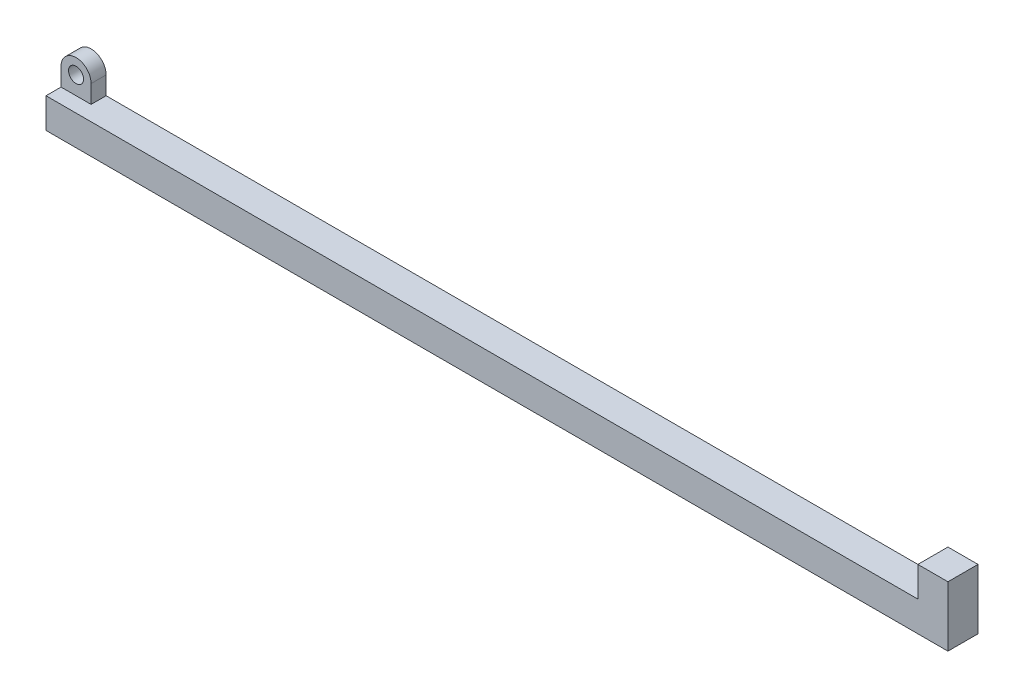
ISO-10303-21;
HEADER;
FILE_DESCRIPTION(('STEP AP214'),'2;1');
FILE_NAME('part.step','',(''),(''),'','','');
FILE_SCHEMA(('AUTOMOTIVE_DESIGN { 1 0 10303 214 1 1 1 1 }'));
ENDSEC;
DATA;
#1=APPLICATION_CONTEXT('core data for automotive mechanical design processes');
#2=APPLICATION_PROTOCOL_DEFINITION('international standard','automotive_design',2000,#1);
#3=PRODUCT_CONTEXT('',#1,'mechanical');
#4=PRODUCT('Part','Part','',(#3));
#5=PRODUCT_RELATED_PRODUCT_CATEGORY('part','',(#4));
#6=PRODUCT_DEFINITION_FORMATION('','',#4);
#7=PRODUCT_DEFINITION_CONTEXT('part definition',#1,'design');
#8=PRODUCT_DEFINITION('design','',#6,#7);
#9=PRODUCT_DEFINITION_SHAPE('','',#8);
#10=(LENGTH_UNIT() NAMED_UNIT(*) SI_UNIT(.MILLI.,.METRE.));
#11=(NAMED_UNIT(*) PLANE_ANGLE_UNIT() SI_UNIT($,.RADIAN.));
#12=(NAMED_UNIT(*) SI_UNIT($,.STERADIAN.) SOLID_ANGLE_UNIT());
#13=UNCERTAINTY_MEASURE_WITH_UNIT(LENGTH_MEASURE(1.E-05),#10,'distance_accuracy_value','');
#14=(GEOMETRIC_REPRESENTATION_CONTEXT(3) GLOBAL_UNCERTAINTY_ASSIGNED_CONTEXT((#13)) GLOBAL_UNIT_ASSIGNED_CONTEXT((#10,
#11,#12)) REPRESENTATION_CONTEXT('',''));
#15=CARTESIAN_POINT('',(0.,0.,0.));
#16=DIRECTION('',(0.,0.,1.));
#17=DIRECTION('',(1.,0.,0.));
#18=AXIS2_PLACEMENT_3D('',#15,#16,#17);
#19=CARTESIAN_POINT('',(50.,-60.,100.));
#20=DIRECTION('',(-1.,0.,0.));
#21=DIRECTION('',(0.,0.,1.));
#22=AXIS2_PLACEMENT_3D('',#19,#20,#21);
#23=PLANE('',#22);
#24=DIRECTION('',(0.,1.,0.));
#25=VECTOR('',#24,1.);
#26=CARTESIAN_POINT('',(50.,-60.,50.));
#27=LINE('',#26,#25);
#28=CARTESIAN_POINT('',(50.,-60.,50.));
#29=VERTEX_POINT('',#28);
#30=CARTESIAN_POINT('',(50.,0.,50.));
#31=VERTEX_POINT('',#30);
#32=EDGE_CURVE('E171',#29,#31,#27,.T.);
#33=ORIENTED_EDGE('',*,*,#32,.F.);
#34=DIRECTION('',(0.,0.,-1.));
#35=VECTOR('',#34,1.);
#36=CARTESIAN_POINT('',(50.,-60.,100.));
#37=LINE('',#36,#35);
#38=CARTESIAN_POINT('',(50.,-60.,0.));
#39=VERTEX_POINT('',#38);
#40=EDGE_CURVE('E90',#29,#39,#37,.T.);
#41=ORIENTED_EDGE('',*,*,#40,.T.);
#42=DIRECTION('',(0.,1.,0.));
#43=VECTOR('',#42,1.);
#44=CARTESIAN_POINT('',(50.,-60.,0.));
#45=LINE('',#44,#43);
#46=CARTESIAN_POINT('',(50.,0.,0.));
#47=VERTEX_POINT('',#46);
#48=EDGE_CURVE('E134',#39,#47,#45,.T.);
#49=ORIENTED_EDGE('',*,*,#48,.T.);
#50=DIRECTION('',(0.,0.,-1.));
#51=VECTOR('',#50,1.);
#52=CARTESIAN_POINT('',(50.,0.,100.));
#53=LINE('',#52,#51);
#54=EDGE_CURVE('E45',#31,#47,#53,.T.);
#55=ORIENTED_EDGE('',*,*,#54,.F.);
#56=EDGE_LOOP('',(#33,#41,#49,#55));
#57=FACE_BOUND('',#56,.T.);
#58=ADVANCED_FACE('F37',(#57),#23,.F.);
#59=CARTESIAN_POINT('',(0.,0.,100.));
#60=DIRECTION('',(0.,0.,-1.));
#61=DIRECTION('',(-1.,0.,0.));
#62=AXIS2_PLACEMENT_3D('',#59,#60,#61);
#63=CYLINDRICAL_SURFACE('',#62,50.);
#64=CARTESIAN_POINT('',(0.,0.,50.));
#65=DIRECTION('',(0.,0.,1.));
#66=DIRECTION('',(1.,0.,0.));
#67=AXIS2_PLACEMENT_3D('',#64,#65,#66);
#68=CIRCLE('',#67,50.);
#69=CARTESIAN_POINT('',(-50.,0.,50.));
#70=VERTEX_POINT('',#69);
#71=EDGE_CURVE('E168',#31,#70,#68,.T.);
#72=ORIENTED_EDGE('',*,*,#71,.F.);
#73=ORIENTED_EDGE('',*,*,#54,.T.);
#74=CARTESIAN_POINT('',(0.,0.,0.));
#75=DIRECTION('',(0.,0.,1.));
#76=DIRECTION('',(1.,0.,0.));
#77=AXIS2_PLACEMENT_3D('',#74,#75,#76);
#78=CIRCLE('',#77,50.);
#79=CARTESIAN_POINT('',(-50.,0.,0.));
#80=VERTEX_POINT('',#79);
#81=EDGE_CURVE('E136',#47,#80,#78,.T.);
#82=ORIENTED_EDGE('',*,*,#81,.T.);
#83=DIRECTION('',(0.,0.,-1.));
#84=VECTOR('',#83,1.);
#85=CARTESIAN_POINT('',(-50.,0.,100.));
#86=LINE('',#85,#84);
#87=EDGE_CURVE('E159',#70,#80,#86,.T.);
#88=ORIENTED_EDGE('',*,*,#87,.F.);
#89=EDGE_LOOP('',(#72,#73,#82,#88));
#90=FACE_BOUND('',#89,.T.);
#91=ADVANCED_FACE('F189',(#90),#63,.T.);
#92=CARTESIAN_POINT('',(0.,0.,100.));
#93=DIRECTION('',(0.,0.,-1.));
#94=DIRECTION('',(-1.,0.,0.));
#95=AXIS2_PLACEMENT_3D('',#92,#93,#94);
#96=CYLINDRICAL_SURFACE('',#95,25.);
#97=CARTESIAN_POINT('',(0.,0.,0.));
#98=DIRECTION('',(0.,0.,1.));
#99=DIRECTION('',(1.,0.,0.));
#100=AXIS2_PLACEMENT_3D('',#97,#98,#99);
#101=CIRCLE('',#100,25.);
#102=CARTESIAN_POINT('',(25.,0.,0.));
#103=VERTEX_POINT('',#102);
#104=EDGE_CURVE('E137',#103,#103,#101,.T.);
#105=ORIENTED_EDGE('',*,*,#104,.F.);
#106=EDGE_LOOP('',(#105));
#107=FACE_BOUND('',#106,.T.);
#108=CARTESIAN_POINT('',(0.,0.,50.));
#109=DIRECTION('',(0.,0.,1.));
#110=DIRECTION('',(1.,0.,0.));
#111=AXIS2_PLACEMENT_3D('',#108,#109,#110);
#112=CIRCLE('',#111,25.);
#113=CARTESIAN_POINT('',(25.,0.,50.));
#114=VERTEX_POINT('',#113);
#115=EDGE_CURVE('E161',#114,#114,#112,.T.);
#116=ORIENTED_EDGE('',*,*,#115,.T.);
#117=EDGE_LOOP('',(#116));
#118=FACE_BOUND('',#117,.T.);
#119=ADVANCED_FACE('F187',(#107,#118),#96,.F.);
#120=CARTESIAN_POINT('',(0.,0.,100.));
#121=DIRECTION('',(0.,0.,1.));
#122=DIRECTION('',(1.,0.,0.));
#123=AXIS2_PLACEMENT_3D('',#120,#121,#122);
#124=PLANE('',#123);
#125=DIRECTION('',(-1.,0.,0.));
#126=VECTOR('',#125,1.);
#127=CARTESIAN_POINT('',(50.,-60.,100.));
#128=LINE('',#127,#126);
#129=CARTESIAN_POINT('',(2850.,-60.,100.));
#130=VERTEX_POINT('',#129);
#131=CARTESIAN_POINT('',(-50.,-60.,100.));
#132=VERTEX_POINT('',#131);
#133=EDGE_CURVE('E129',#130,#132,#128,.T.);
#134=ORIENTED_EDGE('',*,*,#133,.T.);
#135=DIRECTION('',(0.,-1.,0.));
#136=VECTOR('',#135,1.);
#137=CARTESIAN_POINT('',(-50.,-160.,100.));
#138=LINE('',#137,#136);
#139=CARTESIAN_POINT('',(-50.,-160.,100.));
#140=VERTEX_POINT('',#139);
#141=EDGE_CURVE('E97',#132,#140,#138,.T.);
#142=ORIENTED_EDGE('',*,*,#141,.T.);
#143=DIRECTION('',(1.,0.,0.));
#144=VECTOR('',#143,1.);
#145=CARTESIAN_POINT('',(-50.,-160.,100.));
#146=LINE('',#145,#144);
#147=CARTESIAN_POINT('',(2950.,-160.,100.));
#148=VERTEX_POINT('',#147);
#149=EDGE_CURVE('E111',#140,#148,#146,.T.);
#150=ORIENTED_EDGE('',*,*,#149,.T.);
#151=DIRECTION('',(0.,1.,0.));
#152=VECTOR('',#151,1.);
#153=CARTESIAN_POINT('',(2950.,-160.,100.));
#154=LINE('',#153,#152);
#155=CARTESIAN_POINT('',(2950.,40.,100.));
#156=VERTEX_POINT('',#155);
#157=EDGE_CURVE('E104',#148,#156,#154,.T.);
#158=ORIENTED_EDGE('',*,*,#157,.T.);
#159=DIRECTION('',(-1.,0.,0.));
#160=VECTOR('',#159,1.);
#161=CARTESIAN_POINT('',(2850.,40.,100.));
#162=LINE('',#161,#160);
#163=CARTESIAN_POINT('',(2850.,40.,100.));
#164=VERTEX_POINT('',#163);
#165=EDGE_CURVE('E108',#156,#164,#162,.T.);
#166=ORIENTED_EDGE('',*,*,#165,.T.);
#167=DIRECTION('',(0.,-1.,0.));
#168=VECTOR('',#167,1.);
#169=CARTESIAN_POINT('',(2850.,-60.,100.));
#170=LINE('',#169,#168);
#171=EDGE_CURVE('E53',#164,#130,#170,.T.);
#172=ORIENTED_EDGE('',*,*,#171,.T.);
#173=EDGE_LOOP('',(#134,#142,#150,#158,#166,#172));
#174=FACE_BOUND('',#173,.T.);
#175=ADVANCED_FACE('F106',(#174),#124,.T.);
#176=CARTESIAN_POINT('',(0.,0.,0.));
#177=DIRECTION('',(0.,0.,1.));
#178=DIRECTION('',(1.,0.,0.));
#179=AXIS2_PLACEMENT_3D('',#176,#177,#178);
#180=PLANE('',#179);
#181=ORIENTED_EDGE('',*,*,#48,.F.);
#182=DIRECTION('',(-1.,0.,0.));
#183=VECTOR('',#182,1.);
#184=CARTESIAN_POINT('',(50.,-60.,0.));
#185=LINE('',#184,#183);
#186=CARTESIAN_POINT('',(2850.,-60.,0.));
#187=VERTEX_POINT('',#186);
#188=EDGE_CURVE('E148',#187,#39,#185,.T.);
#189=ORIENTED_EDGE('',*,*,#188,.F.);
#190=DIRECTION('',(0.,-1.,0.));
#191=VECTOR('',#190,1.);
#192=CARTESIAN_POINT('',(2850.,-60.,0.));
#193=LINE('',#192,#191);
#194=CARTESIAN_POINT('',(2850.,40.,0.));
#195=VERTEX_POINT('',#194);
#196=EDGE_CURVE('E82',#195,#187,#193,.T.);
#197=ORIENTED_EDGE('',*,*,#196,.F.);
#198=DIRECTION('',(-1.,0.,0.));
#199=VECTOR('',#198,1.);
#200=CARTESIAN_POINT('',(2850.,40.,0.));
#201=LINE('',#200,#199);
#202=CARTESIAN_POINT('',(2950.,40.,0.));
#203=VERTEX_POINT('',#202);
#204=EDGE_CURVE('E145',#203,#195,#201,.T.);
#205=ORIENTED_EDGE('',*,*,#204,.F.);
#206=DIRECTION('',(0.,1.,0.));
#207=VECTOR('',#206,1.);
#208=CARTESIAN_POINT('',(2950.,-160.,0.));
#209=LINE('',#208,#207);
#210=CARTESIAN_POINT('',(2950.,-160.,0.));
#211=VERTEX_POINT('',#210);
#212=EDGE_CURVE('E120',#211,#203,#209,.T.);
#213=ORIENTED_EDGE('',*,*,#212,.F.);
#214=DIRECTION('',(1.,0.,0.));
#215=VECTOR('',#214,1.);
#216=CARTESIAN_POINT('',(-50.,-160.,0.));
#217=LINE('',#216,#215);
#218=CARTESIAN_POINT('',(-50.,-160.,0.));
#219=VERTEX_POINT('',#218);
#220=EDGE_CURVE('E142',#219,#211,#217,.T.);
#221=ORIENTED_EDGE('',*,*,#220,.F.);
#222=DIRECTION('',(0.,-1.,0.));
#223=VECTOR('',#222,1.);
#224=CARTESIAN_POINT('',(-50.,-160.,0.));
#225=LINE('',#224,#223);
#226=EDGE_CURVE('E140',#80,#219,#225,.T.);
#227=ORIENTED_EDGE('',*,*,#226,.F.);
#228=ORIENTED_EDGE('',*,*,#81,.F.);
#229=EDGE_LOOP('',(#181,#189,#197,#205,#213,#221,#227,#228));
#230=FACE_BOUND('',#229,.T.);
#231=ORIENTED_EDGE('',*,*,#104,.T.);
#232=EDGE_LOOP('',(#231));
#233=FACE_BOUND('',#232,.T.);
#234=ADVANCED_FACE('F185',(#230,#233),#180,.F.);
#235=CARTESIAN_POINT('',(-50.,-160.,100.));
#236=DIRECTION('',(1.,0.,0.));
#237=DIRECTION('',(0.,0.,-1.));
#238=AXIS2_PLACEMENT_3D('',#235,#236,#237);
#239=PLANE('',#238);
#240=ORIENTED_EDGE('',*,*,#141,.F.);
#241=DIRECTION('',(0.,0.,-1.));
#242=VECTOR('',#241,1.);
#243=CARTESIAN_POINT('',(-50.,-60.,100.));
#244=LINE('',#243,#242);
#245=CARTESIAN_POINT('',(-50.,-60.,50.));
#246=VERTEX_POINT('',#245);
#247=EDGE_CURVE('E11',#132,#246,#244,.T.);
#248=ORIENTED_EDGE('',*,*,#247,.T.);
#249=DIRECTION('',(0.,-1.,0.));
#250=VECTOR('',#249,1.);
#251=CARTESIAN_POINT('',(-50.,-160.,50.));
#252=LINE('',#251,#250);
#253=EDGE_CURVE('E163',#70,#246,#252,.T.);
#254=ORIENTED_EDGE('',*,*,#253,.F.);
#255=ORIENTED_EDGE('',*,*,#87,.T.);
#256=ORIENTED_EDGE('',*,*,#226,.T.);
#257=DIRECTION('',(0.,0.,-1.));
#258=VECTOR('',#257,1.);
#259=CARTESIAN_POINT('',(-50.,-160.,100.));
#260=LINE('',#259,#258);
#261=EDGE_CURVE('E156',#140,#219,#260,.T.);
#262=ORIENTED_EDGE('',*,*,#261,.F.);
#263=EDGE_LOOP('',(#240,#248,#254,#255,#256,#262));
#264=FACE_BOUND('',#263,.T.);
#265=ADVANCED_FACE('F222',(#264),#239,.F.);
#266=CARTESIAN_POINT('',(-50.,-160.,100.));
#267=DIRECTION('',(0.,1.,0.));
#268=DIRECTION('',(0.,0.,1.));
#269=AXIS2_PLACEMENT_3D('',#266,#267,#268);
#270=PLANE('',#269);
#271=ORIENTED_EDGE('',*,*,#220,.T.);
#272=DIRECTION('',(0.,0.,-1.));
#273=VECTOR('',#272,1.);
#274=CARTESIAN_POINT('',(2950.,-160.,100.));
#275=LINE('',#274,#273);
#276=EDGE_CURVE('E123',#148,#211,#275,.T.);
#277=ORIENTED_EDGE('',*,*,#276,.F.);
#278=ORIENTED_EDGE('',*,*,#149,.F.);
#279=ORIENTED_EDGE('',*,*,#261,.T.);
#280=EDGE_LOOP('',(#271,#277,#278,#279));
#281=FACE_BOUND('',#280,.T.);
#282=ADVANCED_FACE('F225',(#281),#270,.F.);
#283=CARTESIAN_POINT('',(2950.,-160.,100.));
#284=DIRECTION('',(-1.,0.,0.));
#285=DIRECTION('',(0.,0.,1.));
#286=AXIS2_PLACEMENT_3D('',#283,#284,#285);
#287=PLANE('',#286);
#288=ORIENTED_EDGE('',*,*,#212,.T.);
#289=DIRECTION('',(0.,0.,-1.));
#290=VECTOR('',#289,1.);
#291=CARTESIAN_POINT('',(2950.,40.,100.));
#292=LINE('',#291,#290);
#293=EDGE_CURVE('E117',#156,#203,#292,.T.);
#294=ORIENTED_EDGE('',*,*,#293,.F.);
#295=ORIENTED_EDGE('',*,*,#157,.F.);
#296=ORIENTED_EDGE('',*,*,#276,.T.);
#297=EDGE_LOOP('',(#288,#294,#295,#296));
#298=FACE_BOUND('',#297,.T.);
#299=ADVANCED_FACE('F118',(#298),#287,.F.);
#300=CARTESIAN_POINT('',(2850.,40.,100.));
#301=DIRECTION('',(0.,-1.,0.));
#302=DIRECTION('',(0.,0.,-1.));
#303=AXIS2_PLACEMENT_3D('',#300,#301,#302);
#304=PLANE('',#303);
#305=ORIENTED_EDGE('',*,*,#204,.T.);
#306=DIRECTION('',(0.,0.,-1.));
#307=VECTOR('',#306,1.);
#308=CARTESIAN_POINT('',(2850.,40.,100.));
#309=LINE('',#308,#307);
#310=EDGE_CURVE('E124',#164,#195,#309,.T.);
#311=ORIENTED_EDGE('',*,*,#310,.F.);
#312=ORIENTED_EDGE('',*,*,#165,.F.);
#313=ORIENTED_EDGE('',*,*,#293,.T.);
#314=EDGE_LOOP('',(#305,#311,#312,#313));
#315=FACE_BOUND('',#314,.T.);
#316=ADVANCED_FACE('F126',(#315),#304,.F.);
#317=CARTESIAN_POINT('',(2850.,-60.,100.));
#318=DIRECTION('',(1.,0.,0.));
#319=DIRECTION('',(0.,0.,-1.));
#320=AXIS2_PLACEMENT_3D('',#317,#318,#319);
#321=PLANE('',#320);
#322=ORIENTED_EDGE('',*,*,#196,.T.);
#323=DIRECTION('',(0.,0.,-1.));
#324=VECTOR('',#323,1.);
#325=CARTESIAN_POINT('',(2850.,-60.,100.));
#326=LINE('',#325,#324);
#327=EDGE_CURVE('E151',#130,#187,#326,.T.);
#328=ORIENTED_EDGE('',*,*,#327,.F.);
#329=ORIENTED_EDGE('',*,*,#171,.F.);
#330=ORIENTED_EDGE('',*,*,#310,.T.);
#331=EDGE_LOOP('',(#322,#328,#329,#330));
#332=FACE_BOUND('',#331,.T.);
#333=ADVANCED_FACE('F226',(#332),#321,.F.);
#334=CARTESIAN_POINT('',(50.,-60.,100.));
#335=DIRECTION('',(0.,-1.,0.));
#336=DIRECTION('',(0.,0.,-1.));
#337=AXIS2_PLACEMENT_3D('',#334,#335,#336);
#338=PLANE('',#337);
#339=ORIENTED_EDGE('',*,*,#188,.T.);
#340=ORIENTED_EDGE('',*,*,#40,.F.);
#341=DIRECTION('',(1.,0.,0.));
#342=VECTOR('',#341,1.);
#343=CARTESIAN_POINT('',(50.,-60.,50.));
#344=LINE('',#343,#342);
#345=EDGE_CURVE('E164',#246,#29,#344,.T.);
#346=ORIENTED_EDGE('',*,*,#345,.F.);
#347=ORIENTED_EDGE('',*,*,#247,.F.);
#348=ORIENTED_EDGE('',*,*,#133,.F.);
#349=ORIENTED_EDGE('',*,*,#327,.T.);
#350=EDGE_LOOP('',(#339,#340,#346,#347,#348,#349));
#351=FACE_BOUND('',#350,.T.);
#352=ADVANCED_FACE('F207',(#351),#338,.F.);
#353=CARTESIAN_POINT('',(0.,0.,50.));
#354=DIRECTION('',(0.,0.,1.));
#355=DIRECTION('',(1.,0.,0.));
#356=AXIS2_PLACEMENT_3D('',#353,#354,#355);
#357=PLANE('',#356);
#358=ORIENTED_EDGE('',*,*,#115,.F.);
#359=EDGE_LOOP('',(#358));
#360=FACE_BOUND('',#359,.T.);
#361=ORIENTED_EDGE('',*,*,#71,.T.);
#362=ORIENTED_EDGE('',*,*,#253,.T.);
#363=ORIENTED_EDGE('',*,*,#345,.T.);
#364=ORIENTED_EDGE('',*,*,#32,.T.);
#365=EDGE_LOOP('',(#361,#362,#363,#364));
#366=FACE_BOUND('',#365,.T.);
#367=ADVANCED_FACE('F220',(#360,#366),#357,.T.);
#368=CLOSED_SHELL('',(#58,#91,#119,#175,#234,#265,#282,#299,#316,#333,#352,#367));
#369=MANIFOLD_SOLID_BREP('B2',#368);
#370=ADVANCED_BREP_SHAPE_REPRESENTATION('',(#18,#369),#14);
#371=SHAPE_DEFINITION_REPRESENTATION(#9,#370);
ENDSEC;
END-ISO-10303-21;
